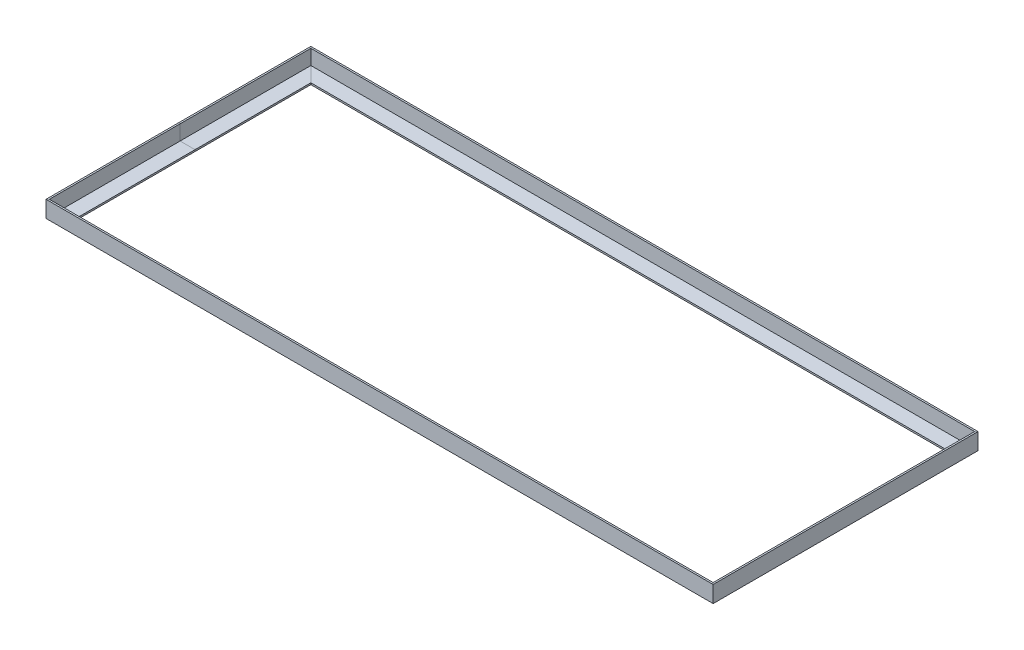
ISO-10303-21;
HEADER;
FILE_DESCRIPTION(('STEP AP214'),'2;1');
FILE_NAME('part.step','',(''),(''),'','','');
FILE_SCHEMA(('AUTOMOTIVE_DESIGN { 1 0 10303 214 1 1 1 1 }'));
ENDSEC;
DATA;
#1=APPLICATION_CONTEXT('core data for automotive mechanical design processes');
#2=APPLICATION_PROTOCOL_DEFINITION('international standard','automotive_design',2000,#1);
#3=PRODUCT_CONTEXT('',#1,'mechanical');
#4=PRODUCT('Part','Part','',(#3));
#5=PRODUCT_RELATED_PRODUCT_CATEGORY('part','',(#4));
#6=PRODUCT_DEFINITION_FORMATION('','',#4);
#7=PRODUCT_DEFINITION_CONTEXT('part definition',#1,'design');
#8=PRODUCT_DEFINITION('design','',#6,#7);
#9=PRODUCT_DEFINITION_SHAPE('','',#8);
#10=(LENGTH_UNIT() NAMED_UNIT(*) SI_UNIT(.MILLI.,.METRE.));
#11=(NAMED_UNIT(*) PLANE_ANGLE_UNIT() SI_UNIT($,.RADIAN.));
#12=(NAMED_UNIT(*) SI_UNIT($,.STERADIAN.) SOLID_ANGLE_UNIT());
#13=UNCERTAINTY_MEASURE_WITH_UNIT(LENGTH_MEASURE(1.E-05),#10,'distance_accuracy_value','');
#14=(GEOMETRIC_REPRESENTATION_CONTEXT(3) GLOBAL_UNCERTAINTY_ASSIGNED_CONTEXT((#13)) GLOBAL_UNIT_ASSIGNED_CONTEXT((#10,
#11,#12)) REPRESENTATION_CONTEXT('',''));
#15=CARTESIAN_POINT('',(0.,0.,0.));
#16=DIRECTION('',(0.,0.,1.));
#17=DIRECTION('',(1.,0.,0.));
#18=AXIS2_PLACEMENT_3D('',#15,#16,#17);
#19=CARTESIAN_POINT('',(1005.,0.,399.));
#20=DIRECTION('',(0.,0.,-1.));
#21=DIRECTION('',(-1.,0.,0.));
#22=AXIS2_PLACEMENT_3D('',#19,#20,#21);
#23=PLANE('',#22);
#24=DIRECTION('',(-1.,0.,0.));
#25=VECTOR('',#24,1.);
#26=CARTESIAN_POINT('',(1005.,0.,399.));
#27=LINE('',#26,#25);
#28=CARTESIAN_POINT('',(1005.,0.,399.));
#29=VERTEX_POINT('',#28);
#30=CARTESIAN_POINT('',(-1005.,0.,399.));
#31=VERTEX_POINT('',#30);
#32=EDGE_CURVE('E209',#29,#31,#27,.T.);
#33=ORIENTED_EDGE('',*,*,#32,.F.);
#34=DIRECTION('',(0.,-1.,0.));
#35=VECTOR('',#34,1.);
#36=CARTESIAN_POINT('',(1005.,0.,399.));
#37=LINE('',#36,#35);
#38=CARTESIAN_POINT('',(1005.,50.,399.));
#39=VERTEX_POINT('',#38);
#40=EDGE_CURVE('E311',#39,#29,#37,.T.);
#41=ORIENTED_EDGE('',*,*,#40,.F.);
#42=DIRECTION('',(-1.,0.,0.));
#43=VECTOR('',#42,1.);
#44=CARTESIAN_POINT('',(1005.,50.,399.));
#45=LINE('',#44,#43);
#46=CARTESIAN_POINT('',(-1005.,50.,399.));
#47=VERTEX_POINT('',#46);
#48=EDGE_CURVE('E141',#39,#47,#45,.T.);
#49=ORIENTED_EDGE('',*,*,#48,.T.);
#50=DIRECTION('',(0.,-1.,0.));
#51=VECTOR('',#50,1.);
#52=CARTESIAN_POINT('',(-1005.,0.,399.));
#53=LINE('',#52,#51);
#54=EDGE_CURVE('E182',#47,#31,#53,.T.);
#55=ORIENTED_EDGE('',*,*,#54,.T.);
#56=EDGE_LOOP('',(#33,#41,#49,#55));
#57=FACE_BOUND('',#56,.T.);
#58=ADVANCED_FACE('F32',(#57),#23,.F.);
#59=CARTESIAN_POINT('',(1005.,50.,394.));
#60=DIRECTION('',(0.,0.,1.));
#61=DIRECTION('',(1.,0.,0.));
#62=AXIS2_PLACEMENT_3D('',#59,#60,#61);
#63=PLANE('',#62);
#64=DIRECTION('',(-1.,0.,0.));
#65=VECTOR('',#64,1.);
#66=CARTESIAN_POINT('',(1005.,50.,394.));
#67=LINE('',#66,#65);
#68=CARTESIAN_POINT('',(1000.,50.,394.));
#69=VERTEX_POINT('',#68);
#70=CARTESIAN_POINT('',(-1000.,50.,394.));
#71=VERTEX_POINT('',#70);
#72=EDGE_CURVE('E134',#69,#71,#67,.T.);
#73=ORIENTED_EDGE('',*,*,#72,.F.);
#74=DIRECTION('',(0.,-1.,0.));
#75=VECTOR('',#74,1.);
#76=CARTESIAN_POINT('',(1000.,50.,394.));
#77=LINE('',#76,#75);
#78=CARTESIAN_POINT('',(1000.,5.,394.));
#79=VERTEX_POINT('',#78);
#80=EDGE_CURVE('E318',#69,#79,#77,.T.);
#81=ORIENTED_EDGE('',*,*,#80,.T.);
#82=DIRECTION('',(-1.,0.,0.));
#83=VECTOR('',#82,1.);
#84=CARTESIAN_POINT('',(1005.,5.,394.));
#85=LINE('',#84,#83);
#86=CARTESIAN_POINT('',(-1000.,5.,394.));
#87=VERTEX_POINT('',#86);
#88=EDGE_CURVE('E142',#79,#87,#85,.T.);
#89=ORIENTED_EDGE('',*,*,#88,.T.);
#90=DIRECTION('',(0.,-1.,0.));
#91=VECTOR('',#90,1.);
#92=CARTESIAN_POINT('',(-1000.,50.,394.));
#93=LINE('',#92,#91);
#94=EDGE_CURVE('E130',#71,#87,#93,.T.);
#95=ORIENTED_EDGE('',*,*,#94,.F.);
#96=EDGE_LOOP('',(#73,#81,#89,#95));
#97=FACE_BOUND('',#96,.T.);
#98=ADVANCED_FACE('F145',(#97),#63,.F.);
#99=CARTESIAN_POINT('',(1005.,50.,399.));
#100=DIRECTION('',(0.,-1.,0.));
#101=DIRECTION('',(0.,0.,-1.));
#102=AXIS2_PLACEMENT_3D('',#99,#100,#101);
#103=PLANE('',#102);
#104=ORIENTED_EDGE('',*,*,#48,.F.);
#105=DIRECTION('',(-0.707106781186548,0.,-0.707106781186548));
#106=VECTOR('',#105,1.);
#107=CARTESIAN_POINT('',(606.,50.,-1.66533453693773E-13));
#108=LINE('',#107,#106);
#109=EDGE_CURVE('E137',#39,#69,#108,.T.);
#110=ORIENTED_EDGE('',*,*,#109,.T.);
#111=ORIENTED_EDGE('',*,*,#72,.T.);
#112=DIRECTION('',(0.707106781186548,0.,-0.707106781186548));
#113=VECTOR('',#112,1.);
#114=CARTESIAN_POINT('',(-1005.,50.,399.));
#115=LINE('',#114,#113);
#116=EDGE_CURVE('E118',#47,#71,#115,.T.);
#117=ORIENTED_EDGE('',*,*,#116,.F.);
#118=EDGE_LOOP('',(#104,#110,#111,#117));
#119=FACE_BOUND('',#118,.T.);
#120=ADVANCED_FACE('F136',(#119),#103,.F.);
#121=CARTESIAN_POINT('',(1005.,0.,349.));
#122=DIRECTION('',(0.,1.,0.));
#123=DIRECTION('',(0.,0.,1.));
#124=AXIS2_PLACEMENT_3D('',#121,#122,#123);
#125=PLANE('',#124);
#126=DIRECTION('',(-1.,0.,0.));
#127=VECTOR('',#126,1.);
#128=CARTESIAN_POINT('',(1005.,0.,349.));
#129=LINE('',#128,#127);
#130=CARTESIAN_POINT('',(955.,0.,349.));
#131=VERTEX_POINT('',#130);
#132=CARTESIAN_POINT('',(-955.,0.,349.));
#133=VERTEX_POINT('',#132);
#134=EDGE_CURVE('E211',#131,#133,#129,.T.);
#135=ORIENTED_EDGE('',*,*,#134,.F.);
#136=DIRECTION('',(0.707106781186548,0.,0.707106781186548));
#137=VECTOR('',#136,1.);
#138=CARTESIAN_POINT('',(581.,0.,-25.0000000000002));
#139=LINE('',#138,#137);
#140=EDGE_CURVE('E129',#131,#29,#139,.T.);
#141=ORIENTED_EDGE('',*,*,#140,.T.);
#142=ORIENTED_EDGE('',*,*,#32,.T.);
#143=DIRECTION('',(-0.707106781186548,0.,0.707106781186548));
#144=VECTOR('',#143,1.);
#145=CARTESIAN_POINT('',(-980.,0.,374.));
#146=LINE('',#145,#144);
#147=EDGE_CURVE('E112',#133,#31,#146,.T.);
#148=ORIENTED_EDGE('',*,*,#147,.F.);
#149=EDGE_LOOP('',(#135,#141,#142,#148));
#150=FACE_BOUND('',#149,.T.);
#151=ADVANCED_FACE('F332',(#150),#125,.F.);
#152=CARTESIAN_POINT('',(1005.,5.,349.));
#153=DIRECTION('',(0.,0.,1.));
#154=DIRECTION('',(1.,0.,0.));
#155=AXIS2_PLACEMENT_3D('',#152,#153,#154);
#156=PLANE('',#155);
#157=DIRECTION('',(-1.,0.,0.));
#158=VECTOR('',#157,1.);
#159=CARTESIAN_POINT('',(1005.,5.,349.));
#160=LINE('',#159,#158);
#161=CARTESIAN_POINT('',(955.,5.,349.));
#162=VERTEX_POINT('',#161);
#163=CARTESIAN_POINT('',(-955.,5.,349.));
#164=VERTEX_POINT('',#163);
#165=EDGE_CURVE('E36',#162,#164,#160,.T.);
#166=ORIENTED_EDGE('',*,*,#165,.F.);
#167=DIRECTION('',(0.,-1.,0.));
#168=VECTOR('',#167,1.);
#169=CARTESIAN_POINT('',(955.,5.,349.));
#170=LINE('',#169,#168);
#171=EDGE_CURVE('E289',#162,#131,#170,.T.);
#172=ORIENTED_EDGE('',*,*,#171,.T.);
#173=ORIENTED_EDGE('',*,*,#134,.T.);
#174=DIRECTION('',(0.,-1.,0.));
#175=VECTOR('',#174,1.);
#176=CARTESIAN_POINT('',(-955.,5.,349.));
#177=LINE('',#176,#175);
#178=EDGE_CURVE('E171',#164,#133,#177,.T.);
#179=ORIENTED_EDGE('',*,*,#178,.F.);
#180=EDGE_LOOP('',(#166,#172,#173,#179));
#181=FACE_BOUND('',#180,.T.);
#182=ADVANCED_FACE('F225',(#181),#156,.F.);
#183=CARTESIAN_POINT('',(1005.,5.,394.));
#184=DIRECTION('',(0.,-1.,0.));
#185=DIRECTION('',(0.,0.,-1.));
#186=AXIS2_PLACEMENT_3D('',#183,#184,#185);
#187=PLANE('',#186);
#188=ORIENTED_EDGE('',*,*,#88,.F.);
#189=DIRECTION('',(-0.707106781186548,0.,-0.707106781186548));
#190=VECTOR('',#189,1.);
#191=CARTESIAN_POINT('',(603.5,5.,-2.50000000000017));
#192=LINE('',#191,#190);
#193=EDGE_CURVE('E222',#79,#162,#192,.T.);
#194=ORIENTED_EDGE('',*,*,#193,.T.);
#195=ORIENTED_EDGE('',*,*,#165,.T.);
#196=DIRECTION('',(0.707106781186548,0.,-0.707106781186548));
#197=VECTOR('',#196,1.);
#198=CARTESIAN_POINT('',(-1002.5,5.,396.5));
#199=LINE('',#198,#197);
#200=EDGE_CURVE('E149',#87,#164,#199,.T.);
#201=ORIENTED_EDGE('',*,*,#200,.F.);
#202=EDGE_LOOP('',(#188,#194,#195,#201));
#203=FACE_BOUND('',#202,.T.);
#204=ADVANCED_FACE('F34',(#203),#187,.F.);
#205=CARTESIAN_POINT('',(-1000.,50.,399.));
#206=DIRECTION('',(-1.,0.,0.));
#207=DIRECTION('',(0.,0.,1.));
#208=AXIS2_PLACEMENT_3D('',#205,#206,#207);
#209=PLANE('',#208);
#210=ORIENTED_EDGE('',*,*,#94,.T.);
#211=DIRECTION('',(0.,0.,-1.));
#212=VECTOR('',#211,1.);
#213=CARTESIAN_POINT('',(-1000.,5.,399.));
#214=LINE('',#213,#212);
#215=CARTESIAN_POINT('',(-1000.,5.,0.));
#216=VERTEX_POINT('',#215);
#217=EDGE_CURVE('E158',#87,#216,#214,.T.);
#218=ORIENTED_EDGE('',*,*,#217,.T.);
#219=DIRECTION('',(0.,1.,0.));
#220=VECTOR('',#219,1.);
#221=CARTESIAN_POINT('',(-1000.,50.,0.));
#222=LINE('',#221,#220);
#223=CARTESIAN_POINT('',(-1000.,50.,0.));
#224=VERTEX_POINT('',#223);
#225=EDGE_CURVE('E154',#216,#224,#222,.T.);
#226=ORIENTED_EDGE('',*,*,#225,.T.);
#227=DIRECTION('',(0.,0.,-1.));
#228=VECTOR('',#227,1.);
#229=CARTESIAN_POINT('',(-1000.,50.,399.));
#230=LINE('',#229,#228);
#231=EDGE_CURVE('E123',#71,#224,#230,.T.);
#232=ORIENTED_EDGE('',*,*,#231,.F.);
#233=EDGE_LOOP('',(#210,#218,#226,#232));
#234=FACE_BOUND('',#233,.T.);
#235=ADVANCED_FACE('F152',(#234),#209,.F.);
#236=CARTESIAN_POINT('',(-1005.,50.,399.));
#237=DIRECTION('',(0.,-1.,0.));
#238=DIRECTION('',(0.,0.,-1.));
#239=AXIS2_PLACEMENT_3D('',#236,#237,#238);
#240=PLANE('',#239);
#241=ORIENTED_EDGE('',*,*,#116,.T.);
#242=ORIENTED_EDGE('',*,*,#231,.T.);
#243=DIRECTION('',(-1.,0.,0.));
#244=VECTOR('',#243,1.);
#245=CARTESIAN_POINT('',(-1005.,50.,0.));
#246=LINE('',#245,#244);
#247=CARTESIAN_POINT('',(-1005.,50.,0.));
#248=VERTEX_POINT('',#247);
#249=EDGE_CURVE('E155',#224,#248,#246,.T.);
#250=ORIENTED_EDGE('',*,*,#249,.T.);
#251=DIRECTION('',(0.,0.,-1.));
#252=VECTOR('',#251,1.);
#253=CARTESIAN_POINT('',(-1005.,50.,399.));
#254=LINE('',#253,#252);
#255=EDGE_CURVE('E126',#47,#248,#254,.T.);
#256=ORIENTED_EDGE('',*,*,#255,.F.);
#257=EDGE_LOOP('',(#241,#242,#250,#256));
#258=FACE_BOUND('',#257,.T.);
#259=ADVANCED_FACE('F120',(#258),#240,.F.);
#260=CARTESIAN_POINT('',(-1005.,0.,399.));
#261=DIRECTION('',(1.,0.,0.));
#262=DIRECTION('',(0.,0.,-1.));
#263=AXIS2_PLACEMENT_3D('',#260,#261,#262);
#264=PLANE('',#263);
#265=DIRECTION('',(0.,0.,-1.));
#266=VECTOR('',#265,1.);
#267=CARTESIAN_POINT('',(-1005.,0.,399.));
#268=LINE('',#267,#266);
#269=CARTESIAN_POINT('',(-1005.,0.,0.));
#270=VERTEX_POINT('',#269);
#271=EDGE_CURVE('E187',#31,#270,#268,.T.);
#272=ORIENTED_EDGE('',*,*,#271,.F.);
#273=ORIENTED_EDGE('',*,*,#54,.F.);
#274=ORIENTED_EDGE('',*,*,#255,.T.);
#275=DIRECTION('',(0.,-1.,0.));
#276=VECTOR('',#275,1.);
#277=CARTESIAN_POINT('',(-1005.,0.,0.));
#278=LINE('',#277,#276);
#279=EDGE_CURVE('E176',#248,#270,#278,.T.);
#280=ORIENTED_EDGE('',*,*,#279,.T.);
#281=EDGE_LOOP('',(#272,#273,#274,#280));
#282=FACE_BOUND('',#281,.T.);
#283=ADVANCED_FACE('F411',(#282),#264,.F.);
#284=CARTESIAN_POINT('',(-955.,0.,399.));
#285=DIRECTION('',(0.,1.,0.));
#286=DIRECTION('',(0.,0.,1.));
#287=AXIS2_PLACEMENT_3D('',#284,#285,#286);
#288=PLANE('',#287);
#289=ORIENTED_EDGE('',*,*,#147,.T.);
#290=ORIENTED_EDGE('',*,*,#271,.T.);
#291=DIRECTION('',(1.,0.,0.));
#292=VECTOR('',#291,1.);
#293=CARTESIAN_POINT('',(-955.,0.,0.));
#294=LINE('',#293,#292);
#295=CARTESIAN_POINT('',(-955.,0.,0.));
#296=VERTEX_POINT('',#295);
#297=EDGE_CURVE('E166',#270,#296,#294,.T.);
#298=ORIENTED_EDGE('',*,*,#297,.T.);
#299=DIRECTION('',(0.,0.,-1.));
#300=VECTOR('',#299,1.);
#301=CARTESIAN_POINT('',(-955.,0.,399.));
#302=LINE('',#301,#300);
#303=EDGE_CURVE('E163',#133,#296,#302,.T.);
#304=ORIENTED_EDGE('',*,*,#303,.F.);
#305=EDGE_LOOP('',(#289,#290,#298,#304));
#306=FACE_BOUND('',#305,.T.);
#307=ADVANCED_FACE('F334',(#306),#288,.F.);
#308=CARTESIAN_POINT('',(-955.,5.,399.));
#309=DIRECTION('',(-1.,0.,0.));
#310=DIRECTION('',(0.,0.,1.));
#311=AXIS2_PLACEMENT_3D('',#308,#309,#310);
#312=PLANE('',#311);
#313=ORIENTED_EDGE('',*,*,#178,.T.);
#314=ORIENTED_EDGE('',*,*,#303,.T.);
#315=DIRECTION('',(0.,1.,0.));
#316=VECTOR('',#315,1.);
#317=CARTESIAN_POINT('',(-955.,5.,0.));
#318=LINE('',#317,#316);
#319=CARTESIAN_POINT('',(-955.,5.,0.));
#320=VERTEX_POINT('',#319);
#321=EDGE_CURVE('E165',#296,#320,#318,.T.);
#322=ORIENTED_EDGE('',*,*,#321,.T.);
#323=DIRECTION('',(0.,0.,-1.));
#324=VECTOR('',#323,1.);
#325=CARTESIAN_POINT('',(-955.,5.,399.));
#326=LINE('',#325,#324);
#327=EDGE_CURVE('E167',#164,#320,#326,.T.);
#328=ORIENTED_EDGE('',*,*,#327,.F.);
#329=EDGE_LOOP('',(#313,#314,#322,#328));
#330=FACE_BOUND('',#329,.T.);
#331=ADVANCED_FACE('F227',(#330),#312,.F.);
#332=CARTESIAN_POINT('',(-1000.,5.,399.));
#333=DIRECTION('',(0.,-1.,0.));
#334=DIRECTION('',(0.,0.,-1.));
#335=AXIS2_PLACEMENT_3D('',#332,#333,#334);
#336=PLANE('',#335);
#337=ORIENTED_EDGE('',*,*,#200,.T.);
#338=ORIENTED_EDGE('',*,*,#327,.T.);
#339=DIRECTION('',(-1.,0.,0.));
#340=VECTOR('',#339,1.);
#341=CARTESIAN_POINT('',(-1000.,5.,0.));
#342=LINE('',#341,#340);
#343=EDGE_CURVE('E168',#320,#216,#342,.T.);
#344=ORIENTED_EDGE('',*,*,#343,.T.);
#345=ORIENTED_EDGE('',*,*,#217,.F.);
#346=EDGE_LOOP('',(#337,#338,#344,#345));
#347=FACE_BOUND('',#346,.T.);
#348=ADVANCED_FACE('F231',(#347),#336,.F.);
#349=CARTESIAN_POINT('',(-1005.,0.,0.));
#350=DIRECTION('',(1.,0.,0.));
#351=DIRECTION('',(0.,0.,-1.));
#352=AXIS2_PLACEMENT_3D('',#349,#350,#351);
#353=PLANE('',#352);
#354=DIRECTION('',(0.,0.,-1.));
#355=VECTOR('',#354,1.);
#356=CARTESIAN_POINT('',(-1005.,0.,0.));
#357=LINE('',#356,#355);
#358=CARTESIAN_POINT('',(-1005.,0.,-399.));
#359=VERTEX_POINT('',#358);
#360=EDGE_CURVE('E180',#270,#359,#357,.T.);
#361=ORIENTED_EDGE('',*,*,#360,.F.);
#362=ORIENTED_EDGE('',*,*,#279,.F.);
#363=DIRECTION('',(0.,0.,-1.));
#364=VECTOR('',#363,1.);
#365=CARTESIAN_POINT('',(-1005.,50.,0.));
#366=LINE('',#365,#364);
#367=CARTESIAN_POINT('',(-1005.,50.,-399.));
#368=VERTEX_POINT('',#367);
#369=EDGE_CURVE('E177',#248,#368,#366,.T.);
#370=ORIENTED_EDGE('',*,*,#369,.T.);
#371=DIRECTION('',(0.,-1.,0.));
#372=VECTOR('',#371,1.);
#373=CARTESIAN_POINT('',(-1005.,0.,-399.));
#374=LINE('',#373,#372);
#375=EDGE_CURVE('E345',#368,#359,#374,.T.);
#376=ORIENTED_EDGE('',*,*,#375,.T.);
#377=EDGE_LOOP('',(#361,#362,#370,#376));
#378=FACE_BOUND('',#377,.T.);
#379=ADVANCED_FACE('F367',(#378),#353,.F.);
#380=CARTESIAN_POINT('',(-1000.,50.,0.));
#381=DIRECTION('',(-1.,0.,0.));
#382=DIRECTION('',(0.,0.,1.));
#383=AXIS2_PLACEMENT_3D('',#380,#381,#382);
#384=PLANE('',#383);
#385=DIRECTION('',(0.,0.,-1.));
#386=VECTOR('',#385,1.);
#387=CARTESIAN_POINT('',(-1000.,50.,0.));
#388=LINE('',#387,#386);
#389=CARTESIAN_POINT('',(-1000.,50.,-394.));
#390=VERTEX_POINT('',#389);
#391=EDGE_CURVE('E181',#224,#390,#388,.T.);
#392=ORIENTED_EDGE('',*,*,#391,.F.);
#393=ORIENTED_EDGE('',*,*,#225,.F.);
#394=DIRECTION('',(0.,0.,-1.));
#395=VECTOR('',#394,1.);
#396=CARTESIAN_POINT('',(-1000.,5.,0.));
#397=LINE('',#396,#395);
#398=CARTESIAN_POINT('',(-1000.,5.,-394.));
#399=VERTEX_POINT('',#398);
#400=EDGE_CURVE('E198',#216,#399,#397,.T.);
#401=ORIENTED_EDGE('',*,*,#400,.T.);
#402=DIRECTION('',(0.,-1.,0.));
#403=VECTOR('',#402,1.);
#404=CARTESIAN_POINT('',(-1000.,50.,-394.));
#405=LINE('',#404,#403);
#406=EDGE_CURVE('E252',#390,#399,#405,.T.);
#407=ORIENTED_EDGE('',*,*,#406,.F.);
#408=EDGE_LOOP('',(#392,#393,#401,#407));
#409=FACE_BOUND('',#408,.T.);
#410=ADVANCED_FACE('F250',(#409),#384,.F.);
#411=CARTESIAN_POINT('',(-1005.,50.,0.));
#412=DIRECTION('',(0.,-1.,0.));
#413=DIRECTION('',(0.,0.,-1.));
#414=AXIS2_PLACEMENT_3D('',#411,#412,#413);
#415=PLANE('',#414);
#416=ORIENTED_EDGE('',*,*,#369,.F.);
#417=ORIENTED_EDGE('',*,*,#249,.F.);
#418=ORIENTED_EDGE('',*,*,#391,.T.);
#419=DIRECTION('',(0.707106781186548,0.,0.707106781186548));
#420=VECTOR('',#419,1.);
#421=CARTESIAN_POINT('',(-1005.,50.,-399.));
#422=LINE('',#421,#420);
#423=EDGE_CURVE('E291',#368,#390,#422,.T.);
#424=ORIENTED_EDGE('',*,*,#423,.F.);
#425=EDGE_LOOP('',(#416,#417,#418,#424));
#426=FACE_BOUND('',#425,.T.);
#427=ADVANCED_FACE('F425',(#426),#415,.F.);
#428=CARTESIAN_POINT('',(-955.,0.,0.));
#429=DIRECTION('',(0.,1.,0.));
#430=DIRECTION('',(0.,0.,1.));
#431=AXIS2_PLACEMENT_3D('',#428,#429,#430);
#432=PLANE('',#431);
#433=DIRECTION('',(0.,0.,-1.));
#434=VECTOR('',#433,1.);
#435=CARTESIAN_POINT('',(-955.,0.,0.));
#436=LINE('',#435,#434);
#437=CARTESIAN_POINT('',(-955.,0.,-349.));
#438=VERTEX_POINT('',#437);
#439=EDGE_CURVE('E191',#296,#438,#436,.T.);
#440=ORIENTED_EDGE('',*,*,#439,.F.);
#441=ORIENTED_EDGE('',*,*,#297,.F.);
#442=ORIENTED_EDGE('',*,*,#360,.T.);
#443=DIRECTION('',(-0.707106781186548,0.,-0.707106781186548));
#444=VECTOR('',#443,1.);
#445=CARTESIAN_POINT('',(-980.,0.,-374.));
#446=LINE('',#445,#444);
#447=EDGE_CURVE('E341',#438,#359,#446,.T.);
#448=ORIENTED_EDGE('',*,*,#447,.F.);
#449=EDGE_LOOP('',(#440,#441,#442,#448));
#450=FACE_BOUND('',#449,.T.);
#451=ADVANCED_FACE('F339',(#450),#432,.F.);
#452=CARTESIAN_POINT('',(-955.,5.,0.));
#453=DIRECTION('',(-1.,0.,0.));
#454=DIRECTION('',(0.,0.,1.));
#455=AXIS2_PLACEMENT_3D('',#452,#453,#454);
#456=PLANE('',#455);
#457=DIRECTION('',(0.,0.,-1.));
#458=VECTOR('',#457,1.);
#459=CARTESIAN_POINT('',(-955.,5.,0.));
#460=LINE('',#459,#458);
#461=CARTESIAN_POINT('',(-955.,5.,-349.));
#462=VERTEX_POINT('',#461);
#463=EDGE_CURVE('E173',#320,#462,#460,.T.);
#464=ORIENTED_EDGE('',*,*,#463,.F.);
#465=ORIENTED_EDGE('',*,*,#321,.F.);
#466=ORIENTED_EDGE('',*,*,#439,.T.);
#467=DIRECTION('',(0.,-1.,0.));
#468=VECTOR('',#467,1.);
#469=CARTESIAN_POINT('',(-955.,5.,-349.));
#470=LINE('',#469,#468);
#471=EDGE_CURVE('E238',#462,#438,#470,.T.);
#472=ORIENTED_EDGE('',*,*,#471,.F.);
#473=EDGE_LOOP('',(#464,#465,#466,#472));
#474=FACE_BOUND('',#473,.T.);
#475=ADVANCED_FACE('F235',(#474),#456,.F.);
#476=CARTESIAN_POINT('',(-1000.,5.,0.));
#477=DIRECTION('',(0.,-1.,0.));
#478=DIRECTION('',(0.,0.,-1.));
#479=AXIS2_PLACEMENT_3D('',#476,#477,#478);
#480=PLANE('',#479);
#481=ORIENTED_EDGE('',*,*,#400,.F.);
#482=ORIENTED_EDGE('',*,*,#343,.F.);
#483=ORIENTED_EDGE('',*,*,#463,.T.);
#484=DIRECTION('',(0.707106781186548,0.,0.707106781186548));
#485=VECTOR('',#484,1.);
#486=CARTESIAN_POINT('',(-1002.5,5.,-396.5));
#487=LINE('',#486,#485);
#488=EDGE_CURVE('E246',#399,#462,#487,.T.);
#489=ORIENTED_EDGE('',*,*,#488,.F.);
#490=EDGE_LOOP('',(#481,#482,#483,#489));
#491=FACE_BOUND('',#490,.T.);
#492=ADVANCED_FACE('F243',(#491),#480,.F.);
#493=CARTESIAN_POINT('',(1005.,0.,-399.));
#494=DIRECTION('',(-1.,0.,0.));
#495=DIRECTION('',(0.,0.,1.));
#496=AXIS2_PLACEMENT_3D('',#493,#494,#495);
#497=PLANE('',#496);
#498=DIRECTION('',(0.,0.,1.));
#499=VECTOR('',#498,1.);
#500=CARTESIAN_POINT('',(1005.,0.,-399.));
#501=LINE('',#500,#499);
#502=CARTESIAN_POINT('',(1005.,0.,-399.));
#503=VERTEX_POINT('',#502);
#504=EDGE_CURVE('E314',#503,#29,#501,.T.);
#505=ORIENTED_EDGE('',*,*,#504,.F.);
#506=DIRECTION('',(0.,-1.,0.));
#507=VECTOR('',#506,1.);
#508=CARTESIAN_POINT('',(1005.,0.,-399.));
#509=LINE('',#508,#507);
#510=CARTESIAN_POINT('',(1005.,50.,-399.));
#511=VERTEX_POINT('',#510);
#512=EDGE_CURVE('E350',#511,#503,#509,.T.);
#513=ORIENTED_EDGE('',*,*,#512,.F.);
#514=DIRECTION('',(0.,0.,1.));
#515=VECTOR('',#514,1.);
#516=CARTESIAN_POINT('',(1005.,50.,-399.));
#517=LINE('',#516,#515);
#518=EDGE_CURVE('E308',#511,#39,#517,.T.);
#519=ORIENTED_EDGE('',*,*,#518,.T.);
#520=ORIENTED_EDGE('',*,*,#40,.T.);
#521=EDGE_LOOP('',(#505,#513,#519,#520));
#522=FACE_BOUND('',#521,.T.);
#523=ADVANCED_FACE('F391',(#522),#497,.F.);
#524=CARTESIAN_POINT('',(1000.,50.,-399.));
#525=DIRECTION('',(1.,0.,0.));
#526=DIRECTION('',(0.,0.,-1.));
#527=AXIS2_PLACEMENT_3D('',#524,#525,#526);
#528=PLANE('',#527);
#529=DIRECTION('',(0.,0.,1.));
#530=VECTOR('',#529,1.);
#531=CARTESIAN_POINT('',(1000.,50.,-399.));
#532=LINE('',#531,#530);
#533=CARTESIAN_POINT('',(1000.,50.,-394.));
#534=VERTEX_POINT('',#533);
#535=EDGE_CURVE('E312',#534,#69,#532,.T.);
#536=ORIENTED_EDGE('',*,*,#535,.F.);
#537=DIRECTION('',(0.,-1.,0.));
#538=VECTOR('',#537,1.);
#539=CARTESIAN_POINT('',(999.999999999999,50.,-394.));
#540=LINE('',#539,#538);
#541=CARTESIAN_POINT('',(1000.,5.,-394.));
#542=VERTEX_POINT('',#541);
#543=EDGE_CURVE('E301',#534,#542,#540,.T.);
#544=ORIENTED_EDGE('',*,*,#543,.T.);
#545=DIRECTION('',(0.,0.,1.));
#546=VECTOR('',#545,1.);
#547=CARTESIAN_POINT('',(1000.,5.,-399.));
#548=LINE('',#547,#546);
#549=EDGE_CURVE('E296',#542,#79,#548,.T.);
#550=ORIENTED_EDGE('',*,*,#549,.T.);
#551=ORIENTED_EDGE('',*,*,#80,.F.);
#552=EDGE_LOOP('',(#536,#544,#550,#551));
#553=FACE_BOUND('',#552,.T.);
#554=ADVANCED_FACE('F394',(#553),#528,.F.);
#555=CARTESIAN_POINT('',(1005.,50.,-399.));
#556=DIRECTION('',(0.,-1.,0.));
#557=DIRECTION('',(0.,0.,-1.));
#558=AXIS2_PLACEMENT_3D('',#555,#556,#557);
#559=PLANE('',#558);
#560=ORIENTED_EDGE('',*,*,#518,.F.);
#561=DIRECTION('',(-0.707106781186548,0.,0.707106781186548));
#562=VECTOR('',#561,1.);
#563=CARTESIAN_POINT('',(-2.22044604925031E-13,50.,606.));
#564=LINE('',#563,#562);
#565=EDGE_CURVE('E51',#511,#534,#564,.T.);
#566=ORIENTED_EDGE('',*,*,#565,.T.);
#567=ORIENTED_EDGE('',*,*,#535,.T.);
#568=ORIENTED_EDGE('',*,*,#109,.F.);
#569=EDGE_LOOP('',(#560,#566,#567,#568));
#570=FACE_BOUND('',#569,.T.);
#571=ADVANCED_FACE('F398',(#570),#559,.F.);
#572=CARTESIAN_POINT('',(955.,0.,-399.));
#573=DIRECTION('',(0.,1.,0.));
#574=DIRECTION('',(0.,0.,1.));
#575=AXIS2_PLACEMENT_3D('',#572,#573,#574);
#576=PLANE('',#575);
#577=DIRECTION('',(0.,0.,1.));
#578=VECTOR('',#577,1.);
#579=CARTESIAN_POINT('',(955.,0.,-399.));
#580=LINE('',#579,#578);
#581=CARTESIAN_POINT('',(954.999999999999,0.,-349.));
#582=VERTEX_POINT('',#581);
#583=EDGE_CURVE('E292',#582,#131,#580,.T.);
#584=ORIENTED_EDGE('',*,*,#583,.F.);
#585=DIRECTION('',(0.707106781186548,0.,-0.707106781186548));
#586=VECTOR('',#585,1.);
#587=CARTESIAN_POINT('',(-25.0000000000004,0.,631.));
#588=LINE('',#587,#586);
#589=EDGE_CURVE('E11',#582,#503,#588,.T.);
#590=ORIENTED_EDGE('',*,*,#589,.T.);
#591=ORIENTED_EDGE('',*,*,#504,.T.);
#592=ORIENTED_EDGE('',*,*,#140,.F.);
#593=EDGE_LOOP('',(#584,#590,#591,#592));
#594=FACE_BOUND('',#593,.T.);
#595=ADVANCED_FACE('F328',(#594),#576,.F.);
#596=CARTESIAN_POINT('',(955.,5.,-399.));
#597=DIRECTION('',(1.,0.,0.));
#598=DIRECTION('',(0.,0.,-1.));
#599=AXIS2_PLACEMENT_3D('',#596,#597,#598);
#600=PLANE('',#599);
#601=DIRECTION('',(0.,0.,1.));
#602=VECTOR('',#601,1.);
#603=CARTESIAN_POINT('',(955.,5.,-399.));
#604=LINE('',#603,#602);
#605=CARTESIAN_POINT('',(955.,5.,-349.));
#606=VERTEX_POINT('',#605);
#607=EDGE_CURVE('E286',#606,#162,#604,.T.);
#608=ORIENTED_EDGE('',*,*,#607,.F.);
#609=DIRECTION('',(0.,-1.,0.));
#610=VECTOR('',#609,1.);
#611=CARTESIAN_POINT('',(954.999999999999,5.,-349.));
#612=LINE('',#611,#610);
#613=EDGE_CURVE('E42',#606,#582,#612,.T.);
#614=ORIENTED_EDGE('',*,*,#613,.T.);
#615=ORIENTED_EDGE('',*,*,#583,.T.);
#616=ORIENTED_EDGE('',*,*,#171,.F.);
#617=EDGE_LOOP('',(#608,#614,#615,#616));
#618=FACE_BOUND('',#617,.T.);
#619=ADVANCED_FACE('F288',(#618),#600,.F.);
#620=CARTESIAN_POINT('',(1000.,5.,-399.));
#621=DIRECTION('',(0.,-1.,0.));
#622=DIRECTION('',(0.,0.,-1.));
#623=AXIS2_PLACEMENT_3D('',#620,#621,#622);
#624=PLANE('',#623);
#625=ORIENTED_EDGE('',*,*,#549,.F.);
#626=DIRECTION('',(-0.707106781186548,0.,0.707106781186548));
#627=VECTOR('',#626,1.);
#628=CARTESIAN_POINT('',(-2.50000000000039,5.,608.5));
#629=LINE('',#628,#627);
#630=EDGE_CURVE('E284',#542,#606,#629,.T.);
#631=ORIENTED_EDGE('',*,*,#630,.T.);
#632=ORIENTED_EDGE('',*,*,#607,.T.);
#633=ORIENTED_EDGE('',*,*,#193,.F.);
#634=EDGE_LOOP('',(#625,#631,#632,#633));
#635=FACE_BOUND('',#634,.T.);
#636=ADVANCED_FACE('F294',(#635),#624,.F.);
#637=CARTESIAN_POINT('',(-1005.,0.,-399.));
#638=DIRECTION('',(0.,0.,1.));
#639=DIRECTION('',(1.,0.,0.));
#640=AXIS2_PLACEMENT_3D('',#637,#638,#639);
#641=PLANE('',#640);
#642=DIRECTION('',(1.,0.,0.));
#643=VECTOR('',#642,1.);
#644=CARTESIAN_POINT('',(-1005.,0.,-399.));
#645=LINE('',#644,#643);
#646=EDGE_CURVE('E304',#359,#503,#645,.T.);
#647=ORIENTED_EDGE('',*,*,#646,.F.);
#648=ORIENTED_EDGE('',*,*,#375,.F.);
#649=DIRECTION('',(1.,0.,0.));
#650=VECTOR('',#649,1.);
#651=CARTESIAN_POINT('',(-1005.,50.,-399.));
#652=LINE('',#651,#650);
#653=EDGE_CURVE('E352',#368,#511,#652,.T.);
#654=ORIENTED_EDGE('',*,*,#653,.T.);
#655=ORIENTED_EDGE('',*,*,#512,.T.);
#656=EDGE_LOOP('',(#647,#648,#654,#655));
#657=FACE_BOUND('',#656,.T.);
#658=ADVANCED_FACE('F371',(#657),#641,.F.);
#659=CARTESIAN_POINT('',(-1005.,50.,-394.));
#660=DIRECTION('',(0.,0.,-1.));
#661=DIRECTION('',(-1.,0.,0.));
#662=AXIS2_PLACEMENT_3D('',#659,#660,#661);
#663=PLANE('',#662);
#664=ORIENTED_EDGE('',*,*,#406,.T.);
#665=DIRECTION('',(1.,0.,0.));
#666=VECTOR('',#665,1.);
#667=CARTESIAN_POINT('',(-1005.,5.,-394.));
#668=LINE('',#667,#666);
#669=EDGE_CURVE('E361',#399,#542,#668,.T.);
#670=ORIENTED_EDGE('',*,*,#669,.T.);
#671=ORIENTED_EDGE('',*,*,#543,.F.);
#672=DIRECTION('',(1.,0.,0.));
#673=VECTOR('',#672,1.);
#674=CARTESIAN_POINT('',(-1005.,50.,-394.));
#675=LINE('',#674,#673);
#676=EDGE_CURVE('E362',#390,#534,#675,.T.);
#677=ORIENTED_EDGE('',*,*,#676,.F.);
#678=EDGE_LOOP('',(#664,#670,#671,#677));
#679=FACE_BOUND('',#678,.T.);
#680=ADVANCED_FACE('F373',(#679),#663,.F.);
#681=CARTESIAN_POINT('',(-1005.,50.,-399.));
#682=DIRECTION('',(0.,-1.,0.));
#683=DIRECTION('',(0.,0.,-1.));
#684=AXIS2_PLACEMENT_3D('',#681,#682,#683);
#685=PLANE('',#684);
#686=ORIENTED_EDGE('',*,*,#423,.T.);
#687=ORIENTED_EDGE('',*,*,#676,.T.);
#688=ORIENTED_EDGE('',*,*,#565,.F.);
#689=ORIENTED_EDGE('',*,*,#653,.F.);
#690=EDGE_LOOP('',(#686,#687,#688,#689));
#691=FACE_BOUND('',#690,.T.);
#692=ADVANCED_FACE('F379',(#691),#685,.F.);
#693=CARTESIAN_POINT('',(-1005.,0.,-349.));
#694=DIRECTION('',(0.,1.,0.));
#695=DIRECTION('',(0.,0.,1.));
#696=AXIS2_PLACEMENT_3D('',#693,#694,#695);
#697=PLANE('',#696);
#698=ORIENTED_EDGE('',*,*,#447,.T.);
#699=ORIENTED_EDGE('',*,*,#646,.T.);
#700=ORIENTED_EDGE('',*,*,#589,.F.);
#701=DIRECTION('',(1.,0.,0.));
#702=VECTOR('',#701,1.);
#703=CARTESIAN_POINT('',(-1005.,0.,-349.));
#704=LINE('',#703,#702);
#705=EDGE_CURVE('E281',#438,#582,#704,.T.);
#706=ORIENTED_EDGE('',*,*,#705,.F.);
#707=EDGE_LOOP('',(#698,#699,#700,#706));
#708=FACE_BOUND('',#707,.T.);
#709=ADVANCED_FACE('F347',(#708),#697,.F.);
#710=CARTESIAN_POINT('',(-1005.,5.,-349.));
#711=DIRECTION('',(0.,0.,-1.));
#712=DIRECTION('',(-1.,0.,0.));
#713=AXIS2_PLACEMENT_3D('',#710,#711,#712);
#714=PLANE('',#713);
#715=ORIENTED_EDGE('',*,*,#471,.T.);
#716=ORIENTED_EDGE('',*,*,#705,.T.);
#717=ORIENTED_EDGE('',*,*,#613,.F.);
#718=DIRECTION('',(1.,0.,0.));
#719=VECTOR('',#718,1.);
#720=CARTESIAN_POINT('',(-1005.,5.,-349.));
#721=LINE('',#720,#719);
#722=EDGE_CURVE('E279',#462,#606,#721,.T.);
#723=ORIENTED_EDGE('',*,*,#722,.F.);
#724=EDGE_LOOP('',(#715,#716,#717,#723));
#725=FACE_BOUND('',#724,.T.);
#726=ADVANCED_FACE('F277',(#725),#714,.F.);
#727=CARTESIAN_POINT('',(-1005.,5.,-394.));
#728=DIRECTION('',(0.,-1.,0.));
#729=DIRECTION('',(0.,0.,-1.));
#730=AXIS2_PLACEMENT_3D('',#727,#728,#729);
#731=PLANE('',#730);
#732=ORIENTED_EDGE('',*,*,#488,.T.);
#733=ORIENTED_EDGE('',*,*,#722,.T.);
#734=ORIENTED_EDGE('',*,*,#630,.F.);
#735=ORIENTED_EDGE('',*,*,#669,.F.);
#736=EDGE_LOOP('',(#732,#733,#734,#735));
#737=FACE_BOUND('',#736,.T.);
#738=ADVANCED_FACE('F300',(#737),#731,.F.);
#739=CLOSED_SHELL('',(#58,#98,#120,#151,#182,#204,#235,#259,#283,#307,#331,#348,#379,#410,#427,
#451,#475,#492,#523,#554,#571,#595,#619,#636,#658,#680,#692,#709,#726,#738));
#740=MANIFOLD_SOLID_BREP('B2',#739);
#741=ADVANCED_BREP_SHAPE_REPRESENTATION('',(#18,#740),#14);
#742=SHAPE_DEFINITION_REPRESENTATION(#9,#741);
ENDSEC;
END-ISO-10303-21;
